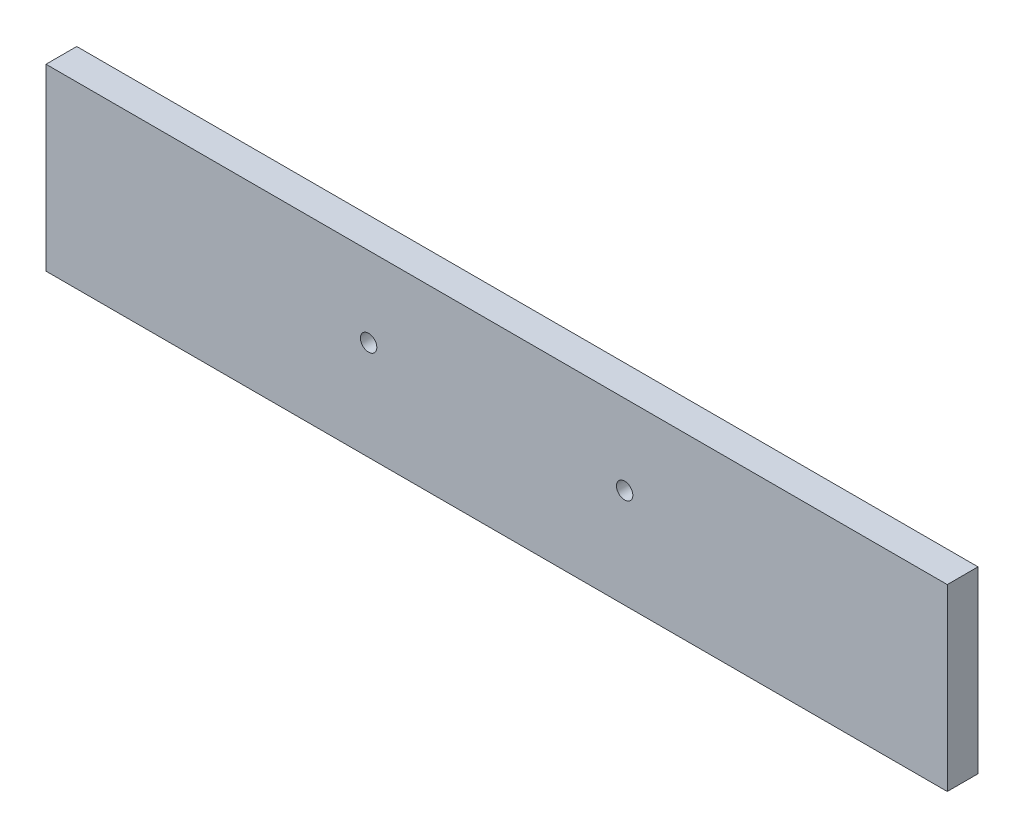
ISO-10303-21;
HEADER;
FILE_DESCRIPTION(('STEP AP214'),'2;1');
FILE_NAME('part.step','',(''),(''),'','','');
FILE_SCHEMA(('AUTOMOTIVE_DESIGN { 1 0 10303 214 1 1 1 1 }'));
ENDSEC;
DATA;
#1=APPLICATION_CONTEXT('core data for automotive mechanical design processes');
#2=APPLICATION_PROTOCOL_DEFINITION('international standard','automotive_design',2000,#1);
#3=PRODUCT_CONTEXT('',#1,'mechanical');
#4=PRODUCT('Part','Part','',(#3));
#5=PRODUCT_RELATED_PRODUCT_CATEGORY('part','',(#4));
#6=PRODUCT_DEFINITION_FORMATION('','',#4);
#7=PRODUCT_DEFINITION_CONTEXT('part definition',#1,'design');
#8=PRODUCT_DEFINITION('design','',#6,#7);
#9=PRODUCT_DEFINITION_SHAPE('','',#8);
#10=(LENGTH_UNIT() NAMED_UNIT(*) SI_UNIT(.MILLI.,.METRE.));
#11=(NAMED_UNIT(*) PLANE_ANGLE_UNIT() SI_UNIT($,.RADIAN.));
#12=(NAMED_UNIT(*) SI_UNIT($,.STERADIAN.) SOLID_ANGLE_UNIT());
#13=UNCERTAINTY_MEASURE_WITH_UNIT(LENGTH_MEASURE(1.E-05),#10,'distance_accuracy_value','');
#14=(GEOMETRIC_REPRESENTATION_CONTEXT(3) GLOBAL_UNCERTAINTY_ASSIGNED_CONTEXT((#13)) GLOBAL_UNIT_ASSIGNED_CONTEXT((#10,
#11,#12)) REPRESENTATION_CONTEXT('',''));
#15=CARTESIAN_POINT('',(0.,0.,0.));
#16=DIRECTION('',(0.,0.,1.));
#17=DIRECTION('',(1.,0.,0.));
#18=AXIS2_PLACEMENT_3D('',#15,#16,#17);
#19=CARTESIAN_POINT('',(0.,0.,6.));
#20=DIRECTION('',(0.,0.,-1.));
#21=DIRECTION('',(-1.,0.,0.));
#22=AXIS2_PLACEMENT_3D('',#19,#20,#21);
#23=PLANE('',#22);
#24=DIRECTION('',(0.,1.,0.));
#25=VECTOR('',#24,1.);
#26=CARTESIAN_POINT('',(88.,-17.5,6.));
#27=LINE('',#26,#25);
#28=CARTESIAN_POINT('',(88.,-17.5,6.));
#29=VERTEX_POINT('',#28);
#30=CARTESIAN_POINT('',(88.,17.5,6.));
#31=VERTEX_POINT('',#30);
#32=EDGE_CURVE('E98',#29,#31,#27,.T.);
#33=ORIENTED_EDGE('',*,*,#32,.T.);
#34=DIRECTION('',(-1.,0.,0.));
#35=VECTOR('',#34,1.);
#36=CARTESIAN_POINT('',(-88.,17.5,6.));
#37=LINE('',#36,#35);
#38=CARTESIAN_POINT('',(-88.,17.5,6.));
#39=VERTEX_POINT('',#38);
#40=EDGE_CURVE('E93',#31,#39,#37,.T.);
#41=ORIENTED_EDGE('',*,*,#40,.T.);
#42=DIRECTION('',(0.,-1.,0.));
#43=VECTOR('',#42,1.);
#44=CARTESIAN_POINT('',(-88.,-17.5,6.));
#45=LINE('',#44,#43);
#46=CARTESIAN_POINT('',(-88.,-17.5,6.));
#47=VERTEX_POINT('',#46);
#48=EDGE_CURVE('E96',#39,#47,#45,.T.);
#49=ORIENTED_EDGE('',*,*,#48,.T.);
#50=DIRECTION('',(1.,0.,0.));
#51=VECTOR('',#50,1.);
#52=CARTESIAN_POINT('',(-88.,-17.5,6.));
#53=LINE('',#52,#51);
#54=EDGE_CURVE('E63',#47,#29,#53,.T.);
#55=ORIENTED_EDGE('',*,*,#54,.T.);
#56=EDGE_LOOP('',(#33,#41,#49,#55));
#57=FACE_BOUND('',#56,.T.);
#58=CARTESIAN_POINT('',(-25.,1.9,6.));
#59=DIRECTION('',(0.,0.,1.));
#60=DIRECTION('',(1.,0.,0.));
#61=AXIS2_PLACEMENT_3D('',#58,#59,#60);
#62=CIRCLE('',#61,1.6);
#63=CARTESIAN_POINT('',(-23.4,1.9,6.));
#64=VERTEX_POINT('',#63);
#65=EDGE_CURVE('E118',#64,#64,#62,.T.);
#66=ORIENTED_EDGE('',*,*,#65,.F.);
#67=EDGE_LOOP('',(#66));
#68=FACE_BOUND('',#67,.T.);
#69=CARTESIAN_POINT('',(25.,1.9,6.));
#70=DIRECTION('',(0.,0.,1.));
#71=DIRECTION('',(-1.,0.,0.));
#72=AXIS2_PLACEMENT_3D('',#69,#70,#71);
#73=CIRCLE('',#72,1.6);
#74=CARTESIAN_POINT('',(23.4,1.9,6.));
#75=VERTEX_POINT('',#74);
#76=EDGE_CURVE('E140',#75,#75,#73,.T.);
#77=ORIENTED_EDGE('',*,*,#76,.F.);
#78=EDGE_LOOP('',(#77));
#79=FACE_BOUND('',#78,.T.);
#80=ADVANCED_FACE('F45',(#57,#68,#79),#23,.F.);
#81=CARTESIAN_POINT('',(0.,0.,0.));
#82=DIRECTION('',(0.,0.,-1.));
#83=DIRECTION('',(-1.,0.,0.));
#84=AXIS2_PLACEMENT_3D('',#81,#82,#83);
#85=PLANE('',#84);
#86=CARTESIAN_POINT('',(-25.,1.9,0.));
#87=DIRECTION('',(0.,0.,1.));
#88=DIRECTION('',(1.,0.,0.));
#89=AXIS2_PLACEMENT_3D('',#86,#87,#88);
#90=CIRCLE('',#89,1.6);
#91=CARTESIAN_POINT('',(-23.4,1.9,0.));
#92=VERTEX_POINT('',#91);
#93=EDGE_CURVE('E136',#92,#92,#90,.T.);
#94=ORIENTED_EDGE('',*,*,#93,.T.);
#95=EDGE_LOOP('',(#94));
#96=FACE_BOUND('',#95,.T.);
#97=DIRECTION('',(0.,1.,0.));
#98=VECTOR('',#97,1.);
#99=CARTESIAN_POINT('',(88.,-17.5,0.));
#100=LINE('',#99,#98);
#101=CARTESIAN_POINT('',(88.,-17.5,0.));
#102=VERTEX_POINT('',#101);
#103=CARTESIAN_POINT('',(88.,17.5,0.));
#104=VERTEX_POINT('',#103);
#105=EDGE_CURVE('E114',#102,#104,#100,.T.);
#106=ORIENTED_EDGE('',*,*,#105,.F.);
#107=DIRECTION('',(1.,0.,0.));
#108=VECTOR('',#107,1.);
#109=CARTESIAN_POINT('',(-88.,-17.5,0.));
#110=LINE('',#109,#108);
#111=CARTESIAN_POINT('',(-88.,-17.5,0.));
#112=VERTEX_POINT('',#111);
#113=EDGE_CURVE('E86',#112,#102,#110,.T.);
#114=ORIENTED_EDGE('',*,*,#113,.F.);
#115=DIRECTION('',(0.,-1.,0.));
#116=VECTOR('',#115,1.);
#117=CARTESIAN_POINT('',(-88.,-17.5,0.));
#118=LINE('',#117,#116);
#119=CARTESIAN_POINT('',(-88.,17.5,0.));
#120=VERTEX_POINT('',#119);
#121=EDGE_CURVE('E80',#120,#112,#118,.T.);
#122=ORIENTED_EDGE('',*,*,#121,.F.);
#123=DIRECTION('',(-1.,0.,0.));
#124=VECTOR('',#123,1.);
#125=CARTESIAN_POINT('',(-88.,17.5,0.));
#126=LINE('',#125,#124);
#127=EDGE_CURVE('E103',#104,#120,#126,.T.);
#128=ORIENTED_EDGE('',*,*,#127,.F.);
#129=EDGE_LOOP('',(#106,#114,#122,#128));
#130=FACE_BOUND('',#129,.T.);
#131=CARTESIAN_POINT('',(25.,1.9,0.));
#132=DIRECTION('',(0.,0.,1.));
#133=DIRECTION('',(-1.,0.,0.));
#134=AXIS2_PLACEMENT_3D('',#131,#132,#133);
#135=CIRCLE('',#134,1.6);
#136=CARTESIAN_POINT('',(23.4,1.9,0.));
#137=VERTEX_POINT('',#136);
#138=EDGE_CURVE('E144',#137,#137,#135,.T.);
#139=ORIENTED_EDGE('',*,*,#138,.T.);
#140=EDGE_LOOP('',(#139));
#141=FACE_BOUND('',#140,.T.);
#142=ADVANCED_FACE('F131',(#96,#130,#141),#85,.T.);
#143=CARTESIAN_POINT('',(88.,-17.5,6.));
#144=DIRECTION('',(-1.,0.,0.));
#145=DIRECTION('',(0.,0.,1.));
#146=AXIS2_PLACEMENT_3D('',#143,#144,#145);
#147=PLANE('',#146);
#148=ORIENTED_EDGE('',*,*,#105,.T.);
#149=DIRECTION('',(0.,0.,-1.));
#150=VECTOR('',#149,1.);
#151=CARTESIAN_POINT('',(88.,17.5,6.));
#152=LINE('',#151,#150);
#153=EDGE_CURVE('E11',#31,#104,#152,.T.);
#154=ORIENTED_EDGE('',*,*,#153,.F.);
#155=ORIENTED_EDGE('',*,*,#32,.F.);
#156=DIRECTION('',(0.,0.,-1.));
#157=VECTOR('',#156,1.);
#158=CARTESIAN_POINT('',(88.,-17.5,6.));
#159=LINE('',#158,#157);
#160=EDGE_CURVE('E110',#29,#102,#159,.T.);
#161=ORIENTED_EDGE('',*,*,#160,.T.);
#162=EDGE_LOOP('',(#148,#154,#155,#161));
#163=FACE_BOUND('',#162,.T.);
#164=ADVANCED_FACE('F47',(#163),#147,.F.);
#165=CARTESIAN_POINT('',(-88.,17.5,6.));
#166=DIRECTION('',(0.,-1.,0.));
#167=DIRECTION('',(0.,0.,-1.));
#168=AXIS2_PLACEMENT_3D('',#165,#166,#167);
#169=PLANE('',#168);
#170=ORIENTED_EDGE('',*,*,#127,.T.);
#171=DIRECTION('',(0.,0.,-1.));
#172=VECTOR('',#171,1.);
#173=CARTESIAN_POINT('',(-88.,17.5,6.));
#174=LINE('',#173,#172);
#175=EDGE_CURVE('E55',#39,#120,#174,.T.);
#176=ORIENTED_EDGE('',*,*,#175,.F.);
#177=ORIENTED_EDGE('',*,*,#40,.F.);
#178=ORIENTED_EDGE('',*,*,#153,.T.);
#179=EDGE_LOOP('',(#170,#176,#177,#178));
#180=FACE_BOUND('',#179,.T.);
#181=ADVANCED_FACE('F102',(#180),#169,.F.);
#182=CARTESIAN_POINT('',(-88.,-17.5,6.));
#183=DIRECTION('',(1.,0.,0.));
#184=DIRECTION('',(0.,0.,-1.));
#185=AXIS2_PLACEMENT_3D('',#182,#183,#184);
#186=PLANE('',#185);
#187=ORIENTED_EDGE('',*,*,#121,.T.);
#188=DIRECTION('',(0.,0.,-1.));
#189=VECTOR('',#188,1.);
#190=CARTESIAN_POINT('',(-88.,-17.5,6.));
#191=LINE('',#190,#189);
#192=EDGE_CURVE('E105',#47,#112,#191,.T.);
#193=ORIENTED_EDGE('',*,*,#192,.F.);
#194=ORIENTED_EDGE('',*,*,#48,.F.);
#195=ORIENTED_EDGE('',*,*,#175,.T.);
#196=EDGE_LOOP('',(#187,#193,#194,#195));
#197=FACE_BOUND('',#196,.T.);
#198=ADVANCED_FACE('F106',(#197),#186,.F.);
#199=CARTESIAN_POINT('',(-88.,-17.5,6.));
#200=DIRECTION('',(0.,1.,0.));
#201=DIRECTION('',(0.,0.,1.));
#202=AXIS2_PLACEMENT_3D('',#199,#200,#201);
#203=PLANE('',#202);
#204=ORIENTED_EDGE('',*,*,#113,.T.);
#205=ORIENTED_EDGE('',*,*,#160,.F.);
#206=ORIENTED_EDGE('',*,*,#54,.F.);
#207=ORIENTED_EDGE('',*,*,#192,.T.);
#208=EDGE_LOOP('',(#204,#205,#206,#207));
#209=FACE_BOUND('',#208,.T.);
#210=ADVANCED_FACE('F128',(#209),#203,.F.);
#211=CARTESIAN_POINT('',(-25.,1.9,6.));
#212=DIRECTION('',(0.,0.,-1.));
#213=DIRECTION('',(-1.,0.,0.));
#214=AXIS2_PLACEMENT_3D('',#211,#212,#213);
#215=CYLINDRICAL_SURFACE('',#214,1.6);
#216=ORIENTED_EDGE('',*,*,#65,.T.);
#217=EDGE_LOOP('',(#216));
#218=FACE_BOUND('',#217,.T.);
#219=ORIENTED_EDGE('',*,*,#93,.F.);
#220=EDGE_LOOP('',(#219));
#221=FACE_BOUND('',#220,.T.);
#222=ADVANCED_FACE('F163',(#218,#221),#215,.F.);
#223=CARTESIAN_POINT('',(25.,1.9,6.));
#224=DIRECTION('',(0.,0.,-1.));
#225=DIRECTION('',(-1.,0.,0.));
#226=AXIS2_PLACEMENT_3D('',#223,#224,#225);
#227=CYLINDRICAL_SURFACE('',#226,1.6);
#228=ORIENTED_EDGE('',*,*,#76,.T.);
#229=EDGE_LOOP('',(#228));
#230=FACE_BOUND('',#229,.T.);
#231=ORIENTED_EDGE('',*,*,#138,.F.);
#232=EDGE_LOOP('',(#231));
#233=FACE_BOUND('',#232,.T.);
#234=ADVANCED_FACE('F152',(#230,#233),#227,.F.);
#235=CLOSED_SHELL('',(#80,#142,#164,#181,#198,#210,#222,#234));
#236=MANIFOLD_SOLID_BREP('B2',#235);
#237=ADVANCED_BREP_SHAPE_REPRESENTATION('',(#18,#236),#14);
#238=SHAPE_DEFINITION_REPRESENTATION(#9,#237);
ENDSEC;
END-ISO-10303-21;
